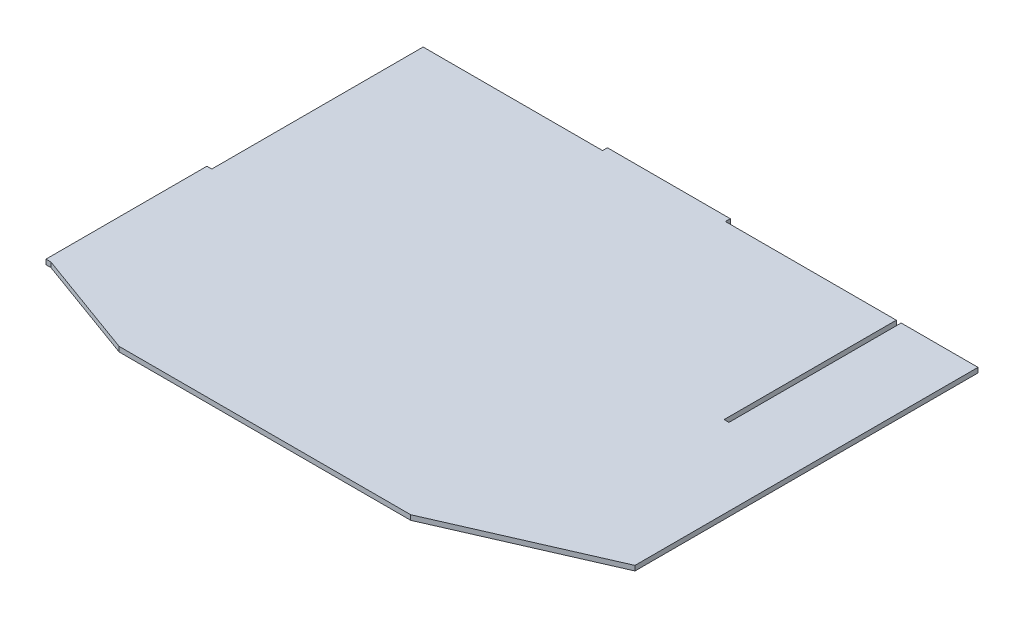
ISO-10303-21;
HEADER;
FILE_DESCRIPTION(('STEP AP214'),'2;1');
FILE_NAME('part.step','',(''),(''),'','','');
FILE_SCHEMA(('AUTOMOTIVE_DESIGN { 1 0 10303 214 1 1 1 1 }'));
ENDSEC;
DATA;
#1=APPLICATION_CONTEXT('core data for automotive mechanical design processes');
#2=APPLICATION_PROTOCOL_DEFINITION('international standard','automotive_design',2000,#1);
#3=PRODUCT_CONTEXT('',#1,'mechanical');
#4=PRODUCT('Part','Part','',(#3));
#5=PRODUCT_RELATED_PRODUCT_CATEGORY('part','',(#4));
#6=PRODUCT_DEFINITION_FORMATION('','',#4);
#7=PRODUCT_DEFINITION_CONTEXT('part definition',#1,'design');
#8=PRODUCT_DEFINITION('design','',#6,#7);
#9=PRODUCT_DEFINITION_SHAPE('','',#8);
#10=(LENGTH_UNIT() NAMED_UNIT(*) SI_UNIT(.MILLI.,.METRE.));
#11=(NAMED_UNIT(*) PLANE_ANGLE_UNIT() SI_UNIT($,.RADIAN.));
#12=(NAMED_UNIT(*) SI_UNIT($,.STERADIAN.) SOLID_ANGLE_UNIT());
#13=UNCERTAINTY_MEASURE_WITH_UNIT(LENGTH_MEASURE(1.E-05),#10,'distance_accuracy_value','');
#14=(GEOMETRIC_REPRESENTATION_CONTEXT(3) GLOBAL_UNCERTAINTY_ASSIGNED_CONTEXT((#13)) GLOBAL_UNIT_ASSIGNED_CONTEXT((#10,
#11,#12)) REPRESENTATION_CONTEXT('',''));
#15=CARTESIAN_POINT('',(0.,0.,0.));
#16=DIRECTION('',(0.,0.,1.));
#17=DIRECTION('',(1.,0.,0.));
#18=AXIS2_PLACEMENT_3D('',#15,#16,#17);
#19=CARTESIAN_POINT('',(-154.0556,-1.5875,267.83));
#20=DIRECTION('',(1.,0.,0.));
#21=DIRECTION('',(0.,0.,-1.));
#22=AXIS2_PLACEMENT_3D('',#19,#20,#21);
#23=PLANE('',#22);
#24=DIRECTION('',(0.,-1.,0.));
#25=VECTOR('',#24,1.);
#26=CARTESIAN_POINT('',(-154.0556,-1.59799669999838,137.650000036));
#27=LINE('',#26,#25);
#28=CARTESIAN_POINT('',(-154.0556,1.5875,137.650000036));
#29=VERTEX_POINT('',#28);
#30=CARTESIAN_POINT('',(-154.0556,-1.5875,137.650000036));
#31=VERTEX_POINT('',#30);
#32=EDGE_CURVE('E58',#29,#31,#27,.T.);
#33=ORIENTED_EDGE('',*,*,#32,.F.);
#34=DIRECTION('',(0.,0.,-1.));
#35=VECTOR('',#34,1.);
#36=CARTESIAN_POINT('',(-154.0556,1.5875,267.83));
#37=LINE('',#36,#35);
#38=CARTESIAN_POINT('',(-154.0556,1.5875,0.));
#39=VERTEX_POINT('',#38);
#40=EDGE_CURVE('E51',#29,#39,#37,.T.);
#41=ORIENTED_EDGE('',*,*,#40,.T.);
#42=DIRECTION('',(0.,-1.,0.));
#43=VECTOR('',#42,1.);
#44=CARTESIAN_POINT('',(-154.0556,-1.5875,0.));
#45=LINE('',#44,#43);
#46=CARTESIAN_POINT('',(-154.0556,-1.5875,0.));
#47=VERTEX_POINT('',#46);
#48=EDGE_CURVE('E289',#39,#47,#45,.T.);
#49=ORIENTED_EDGE('',*,*,#48,.T.);
#50=DIRECTION('',(0.,0.,-1.));
#51=VECTOR('',#50,1.);
#52=CARTESIAN_POINT('',(-154.0556,-1.5875,267.83));
#53=LINE('',#52,#51);
#54=EDGE_CURVE('E297',#31,#47,#53,.T.);
#55=ORIENTED_EDGE('',*,*,#54,.F.);
#56=EDGE_LOOP('',(#33,#41,#49,#55));
#57=FACE_BOUND('',#56,.T.);
#58=ADVANCED_FACE('F43',(#57),#23,.F.);
#59=CARTESIAN_POINT('',(0.,0.,0.));
#60=DIRECTION('',(0.,0.,-1.));
#61=DIRECTION('',(-1.,0.,0.));
#62=AXIS2_PLACEMENT_3D('',#59,#60,#61);
#63=PLANE('',#62);
#64=DIRECTION('',(-1.,0.,0.));
#65=VECTOR('',#64,1.);
#66=CARTESIAN_POINT('',(-154.0556,1.5875,0.));
#67=LINE('',#66,#65);
#68=CARTESIAN_POINT('',(-37.2160000199976,1.58750000000041,0.));
#69=VERTEX_POINT('',#68);
#70=EDGE_CURVE('E285',#69,#39,#67,.T.);
#71=ORIENTED_EDGE('',*,*,#70,.F.);
#72=DIRECTION('',(0.,1.,0.));
#73=VECTOR('',#72,1.);
#74=CARTESIAN_POINT('',(-37.2160000199976,1.58750000000041,0.));
#75=LINE('',#74,#73);
#76=CARTESIAN_POINT('',(-37.2160000199976,-1.5875000000004,0.));
#77=VERTEX_POINT('',#76);
#78=EDGE_CURVE('E205',#77,#69,#75,.T.);
#79=ORIENTED_EDGE('',*,*,#78,.F.);
#80=DIRECTION('',(1.,0.,0.));
#81=VECTOR('',#80,1.);
#82=CARTESIAN_POINT('',(-154.0556,-1.5875,0.));
#83=LINE('',#82,#81);
#84=EDGE_CURVE('E280',#47,#77,#83,.T.);
#85=ORIENTED_EDGE('',*,*,#84,.F.);
#86=ORIENTED_EDGE('',*,*,#48,.F.);
#87=EDGE_LOOP('',(#71,#79,#85,#86));
#88=FACE_BOUND('',#87,.T.);
#89=ADVANCED_FACE('F308',(#88),#63,.T.);
#90=CARTESIAN_POINT('',(42.7839999800023,-1.5875,0.));
#91=VERTEX_POINT('',#90);
#92=CARTESIAN_POINT('',(154.0556,-1.5875,0.));
#93=VERTEX_POINT('',#92);
#94=EDGE_CURVE('E292',#91,#93,#83,.T.);
#95=ORIENTED_EDGE('',*,*,#94,.F.);
#96=DIRECTION('',(0.,-1.,0.));
#97=VECTOR('',#96,1.);
#98=CARTESIAN_POINT('',(42.7839999800024,1.5875000000004,0.));
#99=LINE('',#98,#97);
#100=CARTESIAN_POINT('',(42.7839999800024,1.5875000000004,0.));
#101=VERTEX_POINT('',#100);
#102=EDGE_CURVE('E211',#101,#91,#99,.T.);
#103=ORIENTED_EDGE('',*,*,#102,.F.);
#104=CARTESIAN_POINT('',(154.0556,1.5875,0.));
#105=VERTEX_POINT('',#104);
#106=EDGE_CURVE('E286',#105,#101,#67,.T.);
#107=ORIENTED_EDGE('',*,*,#106,.F.);
#108=DIRECTION('',(0.,1.,0.));
#109=VECTOR('',#108,1.);
#110=CARTESIAN_POINT('',(154.0556,-1.5875,0.));
#111=LINE('',#110,#109);
#112=EDGE_CURVE('E275',#93,#105,#111,.T.);
#113=ORIENTED_EDGE('',*,*,#112,.F.);
#114=EDGE_LOOP('',(#95,#103,#107,#113));
#115=FACE_BOUND('',#114,.T.);
#116=ADVANCED_FACE('F362',(#115),#63,.T.);
#117=CARTESIAN_POINT('',(-154.0556,1.5875,267.83));
#118=DIRECTION('',(0.,-1.,0.));
#119=DIRECTION('',(0.,0.,-1.));
#120=AXIS2_PLACEMENT_3D('',#117,#118,#119);
#121=PLANE('',#120);
#122=ORIENTED_EDGE('',*,*,#40,.F.);
#123=DIRECTION('',(1.,0.,0.));
#124=VECTOR('',#123,1.);
#125=CARTESIAN_POINT('',(-157.2306,1.5875,137.650000036));
#126=LINE('',#125,#124);
#127=CARTESIAN_POINT('',(-157.2306,1.5875,137.650000036));
#128=VERTEX_POINT('',#127);
#129=EDGE_CURVE('E323',#128,#29,#126,.T.);
#130=ORIENTED_EDGE('',*,*,#129,.F.);
#131=DIRECTION('',(0.,0.,-1.));
#132=VECTOR('',#131,1.);
#133=CARTESIAN_POINT('',(-157.2306,1.5875,137.650000036));
#134=LINE('',#133,#132);
#135=CARTESIAN_POINT('',(-157.2306,1.5875,242.43));
#136=VERTEX_POINT('',#135);
#137=EDGE_CURVE('E183',#136,#128,#134,.T.);
#138=ORIENTED_EDGE('',*,*,#137,.F.);
#139=DIRECTION('',(1.,0.,0.));
#140=VECTOR('',#139,1.);
#141=CARTESIAN_POINT('',(-157.2306,1.5875,242.43));
#142=LINE('',#141,#140);
#143=CARTESIAN_POINT('',(-154.0556,1.5875,242.43));
#144=VERTEX_POINT('',#143);
#145=EDGE_CURVE('E196',#136,#144,#142,.T.);
#146=ORIENTED_EDGE('',*,*,#145,.T.);
#147=DIRECTION('',(0.939793423488437,0.,0.341743063086704));
#148=VECTOR('',#147,1.);
#149=CARTESIAN_POINT('',(-95.8526248175183,1.58750000000041,263.594718248175));
#150=LINE('',#149,#148);
#151=CARTESIAN_POINT('',(-84.2056,1.58750000000041,267.83));
#152=VERTEX_POINT('',#151);
#153=EDGE_CURVE('E66',#144,#152,#150,.T.);
#154=ORIENTED_EDGE('',*,*,#153,.T.);
#155=DIRECTION('',(-1.,0.,0.));
#156=VECTOR('',#155,1.);
#157=CARTESIAN_POINT('',(-154.0556,1.5875,267.83));
#158=LINE('',#157,#156);
#159=CARTESIAN_POINT('',(105.6686,1.5875,267.83));
#160=VERTEX_POINT('',#159);
#161=EDGE_CURVE('E276',#160,#152,#158,.T.);
#162=ORIENTED_EDGE('',*,*,#161,.F.);
#163=DIRECTION('',(0.916157334902189,0.,-0.400818834019708));
#164=VECTOR('',#163,1.);
#165=CARTESIAN_POINT('',(115.326955409836,1.5875,263.604469508197));
#166=LINE('',#165,#164);
#167=CARTESIAN_POINT('',(207.2686,1.5875,223.38));
#168=VERTEX_POINT('',#167);
#169=EDGE_CURVE('E229',#160,#168,#166,.T.);
#170=ORIENTED_EDGE('',*,*,#169,.T.);
#171=DIRECTION('',(0.,0.,1.));
#172=VECTOR('',#171,1.);
#173=CARTESIAN_POINT('',(207.2686,1.5875,0.));
#174=LINE('',#173,#172);
#175=CARTESIAN_POINT('',(207.2686,1.5875,0.));
#176=VERTEX_POINT('',#175);
#177=EDGE_CURVE('E256',#176,#168,#174,.T.);
#178=ORIENTED_EDGE('',*,*,#177,.F.);
#179=DIRECTION('',(-1.,0.,0.));
#180=VECTOR('',#179,1.);
#181=CARTESIAN_POINT('',(157.2306,1.5875,0.));
#182=LINE('',#181,#180);
#183=CARTESIAN_POINT('',(157.2306,1.5875,0.));
#184=VERTEX_POINT('',#183);
#185=EDGE_CURVE('E248',#176,#184,#182,.T.);
#186=ORIENTED_EDGE('',*,*,#185,.T.);
#187=DIRECTION('',(0.,0.,1.));
#188=VECTOR('',#187,1.);
#189=CARTESIAN_POINT('',(157.2306,1.5875,0.));
#190=LINE('',#189,#188);
#191=CARTESIAN_POINT('',(157.2306,1.5875,112.128));
#192=VERTEX_POINT('',#191);
#193=EDGE_CURVE('E252',#184,#192,#190,.T.);
#194=ORIENTED_EDGE('',*,*,#193,.T.);
#195=DIRECTION('',(-1.,0.,0.));
#196=VECTOR('',#195,1.);
#197=CARTESIAN_POINT('',(157.2306,1.5875,112.128));
#198=LINE('',#197,#196);
#199=CARTESIAN_POINT('',(154.0556,1.5875,112.128));
#200=VERTEX_POINT('',#199);
#201=EDGE_CURVE('E267',#192,#200,#198,.T.);
#202=ORIENTED_EDGE('',*,*,#201,.T.);
#203=DIRECTION('',(0.,0.,-1.));
#204=VECTOR('',#203,1.);
#205=CARTESIAN_POINT('',(154.0556,1.5875,267.83));
#206=LINE('',#205,#204);
#207=EDGE_CURVE('E11',#200,#105,#206,.T.);
#208=ORIENTED_EDGE('',*,*,#207,.T.);
#209=ORIENTED_EDGE('',*,*,#106,.T.);
#210=DIRECTION('',(0.,0.,1.));
#211=VECTOR('',#210,1.);
#212=CARTESIAN_POINT('',(42.7839999800024,1.5875000000004,-3.175));
#213=LINE('',#212,#211);
#214=CARTESIAN_POINT('',(42.7839999800024,1.5875000000004,-3.175));
#215=VERTEX_POINT('',#214);
#216=EDGE_CURVE('E225',#215,#101,#213,.T.);
#217=ORIENTED_EDGE('',*,*,#216,.F.);
#218=DIRECTION('',(1.,0.,0.));
#219=VECTOR('',#218,1.);
#220=CARTESIAN_POINT('',(-37.2160000199976,1.58750000000041,-3.175));
#221=LINE('',#220,#219);
#222=CARTESIAN_POINT('',(-37.2160000199976,1.58750000000041,-3.175));
#223=VERTEX_POINT('',#222);
#224=EDGE_CURVE('E210',#223,#215,#221,.T.);
#225=ORIENTED_EDGE('',*,*,#224,.F.);
#226=DIRECTION('',(0.,0.,1.));
#227=VECTOR('',#226,1.);
#228=CARTESIAN_POINT('',(-37.2160000199976,1.58750000000041,-3.175));
#229=LINE('',#228,#227);
#230=EDGE_CURVE('E227',#223,#69,#229,.T.);
#231=ORIENTED_EDGE('',*,*,#230,.T.);
#232=ORIENTED_EDGE('',*,*,#70,.T.);
#233=EDGE_LOOP('',(#122,#130,#138,#146,#154,#162,#170,#178,#186,#194,#202,#208,#209,#217,#225,
#231,#232));
#234=FACE_BOUND('',#233,.T.);
#235=ADVANCED_FACE('F304',(#234),#121,.F.);
#236=CARTESIAN_POINT('',(-154.0556,-1.5875,267.83));
#237=DIRECTION('',(0.,1.,0.));
#238=DIRECTION('',(0.,0.,1.));
#239=AXIS2_PLACEMENT_3D('',#236,#237,#238);
#240=PLANE('',#239);
#241=DIRECTION('',(1.,0.,0.));
#242=VECTOR('',#241,1.);
#243=CARTESIAN_POINT('',(-154.0556,-1.5875,267.83));
#244=LINE('',#243,#242);
#245=CARTESIAN_POINT('',(-84.2056,-1.5875,267.83));
#246=VERTEX_POINT('',#245);
#247=CARTESIAN_POINT('',(105.6686,-1.5875,267.83));
#248=VERTEX_POINT('',#247);
#249=EDGE_CURVE('E279',#246,#248,#244,.T.);
#250=ORIENTED_EDGE('',*,*,#249,.F.);
#251=DIRECTION('',(0.939793423488437,0.,0.341743063086704));
#252=VECTOR('',#251,1.);
#253=CARTESIAN_POINT('',(-95.8526248175183,-1.5875,263.594718248175));
#254=LINE('',#253,#252);
#255=CARTESIAN_POINT('',(-154.0556,-1.5875,242.43));
#256=VERTEX_POINT('',#255);
#257=EDGE_CURVE('E193',#256,#246,#254,.T.);
#258=ORIENTED_EDGE('',*,*,#257,.F.);
#259=EDGE_CURVE('E298',#256,#31,#53,.T.);
#260=ORIENTED_EDGE('',*,*,#259,.T.);
#261=ORIENTED_EDGE('',*,*,#54,.T.);
#262=ORIENTED_EDGE('',*,*,#84,.T.);
#263=DIRECTION('',(0.,0.,1.));
#264=VECTOR('',#263,1.);
#265=CARTESIAN_POINT('',(-37.2160000199976,-1.5875000000004,-3.175));
#266=LINE('',#265,#264);
#267=CARTESIAN_POINT('',(-37.2160000199976,-1.5875000000004,-3.175));
#268=VERTEX_POINT('',#267);
#269=EDGE_CURVE('E217',#268,#77,#266,.T.);
#270=ORIENTED_EDGE('',*,*,#269,.F.);
#271=DIRECTION('',(-1.,0.,0.));
#272=VECTOR('',#271,1.);
#273=CARTESIAN_POINT('',(-37.2160000199976,-1.5875000000004,-3.175));
#274=LINE('',#273,#272);
#275=CARTESIAN_POINT('',(42.7839999800024,-1.58750000000041,-3.175));
#276=VERTEX_POINT('',#275);
#277=EDGE_CURVE('E215',#276,#268,#274,.T.);
#278=ORIENTED_EDGE('',*,*,#277,.F.);
#279=DIRECTION('',(0.,0.,1.));
#280=VECTOR('',#279,1.);
#281=CARTESIAN_POINT('',(42.7839999800024,-1.58750000000041,-3.175));
#282=LINE('',#281,#280);
#283=EDGE_CURVE('E223',#276,#91,#282,.T.);
#284=ORIENTED_EDGE('',*,*,#283,.T.);
#285=ORIENTED_EDGE('',*,*,#94,.T.);
#286=DIRECTION('',(0.,0.,-1.));
#287=VECTOR('',#286,1.);
#288=CARTESIAN_POINT('',(154.0556,-1.5875,267.83));
#289=LINE('',#288,#287);
#290=CARTESIAN_POINT('',(154.0556,-1.5875,112.128));
#291=VERTEX_POINT('',#290);
#292=EDGE_CURVE('E282',#291,#93,#289,.T.);
#293=ORIENTED_EDGE('',*,*,#292,.F.);
#294=DIRECTION('',(-1.,0.,0.));
#295=VECTOR('',#294,1.);
#296=CARTESIAN_POINT('',(157.2306,-1.5875,112.128));
#297=LINE('',#296,#295);
#298=CARTESIAN_POINT('',(157.2306,-1.5875,112.128));
#299=VERTEX_POINT('',#298);
#300=EDGE_CURVE('E272',#299,#291,#297,.T.);
#301=ORIENTED_EDGE('',*,*,#300,.F.);
#302=DIRECTION('',(0.,0.,1.));
#303=VECTOR('',#302,1.);
#304=CARTESIAN_POINT('',(157.2306,-1.5875,0.));
#305=LINE('',#304,#303);
#306=CARTESIAN_POINT('',(157.2306,-1.5875,0.));
#307=VERTEX_POINT('',#306);
#308=EDGE_CURVE('E251',#307,#299,#305,.T.);
#309=ORIENTED_EDGE('',*,*,#308,.F.);
#310=DIRECTION('',(1.,0.,0.));
#311=VECTOR('',#310,1.);
#312=CARTESIAN_POINT('',(157.2306,-1.5875,0.));
#313=LINE('',#312,#311);
#314=CARTESIAN_POINT('',(207.2686,-1.5875,0.));
#315=VERTEX_POINT('',#314);
#316=EDGE_CURVE('E242',#307,#315,#313,.T.);
#317=ORIENTED_EDGE('',*,*,#316,.T.);
#318=DIRECTION('',(0.,0.,1.));
#319=VECTOR('',#318,1.);
#320=CARTESIAN_POINT('',(207.2686,-1.5875,0.));
#321=LINE('',#320,#319);
#322=CARTESIAN_POINT('',(207.2686,-1.5875,223.38));
#323=VERTEX_POINT('',#322);
#324=EDGE_CURVE('E259',#315,#323,#321,.T.);
#325=ORIENTED_EDGE('',*,*,#324,.T.);
#326=DIRECTION('',(0.916157334902189,0.,-0.400818834019708));
#327=VECTOR('',#326,1.);
#328=CARTESIAN_POINT('',(115.326955409836,-1.5875,263.604469508197));
#329=LINE('',#328,#327);
#330=EDGE_CURVE('E230',#248,#323,#329,.T.);
#331=ORIENTED_EDGE('',*,*,#330,.F.);
#332=EDGE_LOOP('',(#250,#258,#260,#261,#262,#270,#278,#284,#285,#293,#301,#309,#317,#325,#331));
#333=FACE_BOUND('',#332,.T.);
#334=ADVANCED_FACE('F312',(#333),#240,.F.);
#335=CARTESIAN_POINT('',(0.,0.,267.83));
#336=DIRECTION('',(0.,0.,-1.));
#337=DIRECTION('',(-1.,0.,0.));
#338=AXIS2_PLACEMENT_3D('',#335,#336,#337);
#339=PLANE('',#338);
#340=ORIENTED_EDGE('',*,*,#161,.T.);
#341=DIRECTION('',(0.,-1.,0.));
#342=VECTOR('',#341,1.);
#343=CARTESIAN_POINT('',(-84.2056,1.58750000000041,267.83));
#344=LINE('',#343,#342);
#345=EDGE_CURVE('E202',#152,#246,#344,.T.);
#346=ORIENTED_EDGE('',*,*,#345,.T.);
#347=ORIENTED_EDGE('',*,*,#249,.T.);
#348=DIRECTION('',(0.,1.,0.));
#349=VECTOR('',#348,1.);
#350=CARTESIAN_POINT('',(105.6686,-1.5875,267.83));
#351=LINE('',#350,#349);
#352=EDGE_CURVE('E232',#248,#160,#351,.T.);
#353=ORIENTED_EDGE('',*,*,#352,.T.);
#354=EDGE_LOOP('',(#340,#346,#347,#353));
#355=FACE_BOUND('',#354,.T.);
#356=ADVANCED_FACE('F338',(#355),#339,.F.);
#357=CARTESIAN_POINT('',(207.2686,-1.5875,0.));
#358=DIRECTION('',(1.,0.,0.));
#359=DIRECTION('',(0.,0.,-1.));
#360=AXIS2_PLACEMENT_3D('',#357,#358,#359);
#361=PLANE('',#360);
#362=ORIENTED_EDGE('',*,*,#177,.T.);
#363=DIRECTION('',(0.,1.,0.));
#364=VECTOR('',#363,1.);
#365=CARTESIAN_POINT('',(207.2686,-1.5875,223.38));
#366=LINE('',#365,#364);
#367=EDGE_CURVE('E235',#323,#168,#366,.T.);
#368=ORIENTED_EDGE('',*,*,#367,.F.);
#369=ORIENTED_EDGE('',*,*,#324,.F.);
#370=DIRECTION('',(0.,1.,0.));
#371=VECTOR('',#370,1.);
#372=CARTESIAN_POINT('',(207.2686,-1.5875,0.));
#373=LINE('',#372,#371);
#374=EDGE_CURVE('E245',#315,#176,#373,.T.);
#375=ORIENTED_EDGE('',*,*,#374,.T.);
#376=EDGE_LOOP('',(#362,#368,#369,#375));
#377=FACE_BOUND('',#376,.T.);
#378=ADVANCED_FACE('F343',(#377),#361,.T.);
#379=CARTESIAN_POINT('',(154.0556,-1.5875,267.83));
#380=DIRECTION('',(-1.,0.,0.));
#381=DIRECTION('',(0.,0.,1.));
#382=AXIS2_PLACEMENT_3D('',#379,#380,#381);
#383=PLANE('',#382);
#384=DIRECTION('',(0.,1.,0.));
#385=VECTOR('',#384,1.);
#386=CARTESIAN_POINT('',(154.0556,-1.5875,112.128));
#387=LINE('',#386,#385);
#388=EDGE_CURVE('E255',#291,#200,#387,.T.);
#389=ORIENTED_EDGE('',*,*,#388,.F.);
#390=ORIENTED_EDGE('',*,*,#292,.T.);
#391=ORIENTED_EDGE('',*,*,#112,.T.);
#392=ORIENTED_EDGE('',*,*,#207,.F.);
#393=EDGE_LOOP('',(#389,#390,#391,#392));
#394=FACE_BOUND('',#393,.T.);
#395=ADVANCED_FACE('F45',(#394),#383,.F.);
#396=CARTESIAN_POINT('',(157.2306,-1.5875,112.128));
#397=DIRECTION('',(0.,0.,1.));
#398=DIRECTION('',(1.,0.,0.));
#399=AXIS2_PLACEMENT_3D('',#396,#397,#398);
#400=PLANE('',#399);
#401=ORIENTED_EDGE('',*,*,#388,.T.);
#402=ORIENTED_EDGE('',*,*,#201,.F.);
#403=DIRECTION('',(0.,1.,0.));
#404=VECTOR('',#403,1.);
#405=CARTESIAN_POINT('',(157.2306,-1.5875,112.128));
#406=LINE('',#405,#404);
#407=EDGE_CURVE('E264',#299,#192,#406,.T.);
#408=ORIENTED_EDGE('',*,*,#407,.F.);
#409=ORIENTED_EDGE('',*,*,#300,.T.);
#410=EDGE_LOOP('',(#401,#402,#408,#409));
#411=FACE_BOUND('',#410,.T.);
#412=ADVANCED_FACE('F354',(#411),#400,.F.);
#413=CARTESIAN_POINT('',(157.2306,-1.5875,0.));
#414=DIRECTION('',(-1.,0.,0.));
#415=DIRECTION('',(0.,0.,1.));
#416=AXIS2_PLACEMENT_3D('',#413,#414,#415);
#417=PLANE('',#416);
#418=ORIENTED_EDGE('',*,*,#308,.T.);
#419=ORIENTED_EDGE('',*,*,#407,.T.);
#420=ORIENTED_EDGE('',*,*,#193,.F.);
#421=DIRECTION('',(0.,-1.,0.));
#422=VECTOR('',#421,1.);
#423=CARTESIAN_POINT('',(157.2306,-1.5875,0.));
#424=LINE('',#423,#422);
#425=EDGE_CURVE('E237',#184,#307,#424,.T.);
#426=ORIENTED_EDGE('',*,*,#425,.T.);
#427=EDGE_LOOP('',(#418,#419,#420,#426));
#428=FACE_BOUND('',#427,.T.);
#429=ADVANCED_FACE('F351',(#428),#417,.T.);
#430=CARTESIAN_POINT('',(0.,0.,0.));
#431=DIRECTION('',(0.,0.,-1.));
#432=DIRECTION('',(-1.,0.,0.));
#433=AXIS2_PLACEMENT_3D('',#430,#431,#432);
#434=PLANE('',#433);
#435=ORIENTED_EDGE('',*,*,#425,.F.);
#436=ORIENTED_EDGE('',*,*,#185,.F.);
#437=ORIENTED_EDGE('',*,*,#374,.F.);
#438=ORIENTED_EDGE('',*,*,#316,.F.);
#439=EDGE_LOOP('',(#435,#436,#437,#438));
#440=FACE_BOUND('',#439,.T.);
#441=ADVANCED_FACE('F349',(#440),#434,.T.);
#442=CARTESIAN_POINT('',(115.326955409836,-1.5875,263.604469508197));
#443=DIRECTION('',(0.400818834019708,0.,0.916157334902189));
#444=DIRECTION('',(0.916157334902189,0.,-0.400818834019708));
#445=AXIS2_PLACEMENT_3D('',#442,#443,#444);
#446=PLANE('',#445);
#447=ORIENTED_EDGE('',*,*,#169,.F.);
#448=ORIENTED_EDGE('',*,*,#352,.F.);
#449=ORIENTED_EDGE('',*,*,#330,.T.);
#450=ORIENTED_EDGE('',*,*,#367,.T.);
#451=EDGE_LOOP('',(#447,#448,#449,#450));
#452=FACE_BOUND('',#451,.T.);
#453=ADVANCED_FACE('F340',(#452),#446,.T.);
#454=CARTESIAN_POINT('',(-37.2160000199976,1.58750000000041,-3.175));
#455=DIRECTION('',(1.,0.,0.));
#456=DIRECTION('',(0.,0.,-1.));
#457=AXIS2_PLACEMENT_3D('',#454,#455,#456);
#458=PLANE('',#457);
#459=ORIENTED_EDGE('',*,*,#78,.T.);
#460=ORIENTED_EDGE('',*,*,#230,.F.);
#461=DIRECTION('',(0.,1.,0.));
#462=VECTOR('',#461,1.);
#463=CARTESIAN_POINT('',(-37.2160000199976,1.58750000000041,-3.175));
#464=LINE('',#463,#462);
#465=EDGE_CURVE('E207',#268,#223,#464,.T.);
#466=ORIENTED_EDGE('',*,*,#465,.F.);
#467=ORIENTED_EDGE('',*,*,#269,.T.);
#468=EDGE_LOOP('',(#459,#460,#466,#467));
#469=FACE_BOUND('',#468,.T.);
#470=ADVANCED_FACE('F371',(#469),#458,.F.);
#471=CARTESIAN_POINT('',(42.7839999800024,1.5875000000004,-3.175));
#472=DIRECTION('',(-1.,0.,0.));
#473=DIRECTION('',(0.,-1.,0.));
#474=AXIS2_PLACEMENT_3D('',#471,#472,#473);
#475=PLANE('',#474);
#476=ORIENTED_EDGE('',*,*,#102,.T.);
#477=ORIENTED_EDGE('',*,*,#283,.F.);
#478=DIRECTION('',(0.,-1.,0.));
#479=VECTOR('',#478,1.);
#480=CARTESIAN_POINT('',(42.7839999800024,1.5875000000004,-3.175));
#481=LINE('',#480,#479);
#482=EDGE_CURVE('E213',#215,#276,#481,.T.);
#483=ORIENTED_EDGE('',*,*,#482,.F.);
#484=ORIENTED_EDGE('',*,*,#216,.T.);
#485=EDGE_LOOP('',(#476,#477,#483,#484));
#486=FACE_BOUND('',#485,.T.);
#487=ADVANCED_FACE('F367',(#486),#475,.F.);
#488=CARTESIAN_POINT('',(0.,0.,-3.175));
#489=DIRECTION('',(0.,0.,1.));
#490=DIRECTION('',(1.,0.,0.));
#491=AXIS2_PLACEMENT_3D('',#488,#489,#490);
#492=PLANE('',#491);
#493=ORIENTED_EDGE('',*,*,#465,.T.);
#494=ORIENTED_EDGE('',*,*,#224,.T.);
#495=ORIENTED_EDGE('',*,*,#482,.T.);
#496=ORIENTED_EDGE('',*,*,#277,.T.);
#497=EDGE_LOOP('',(#493,#494,#495,#496));
#498=FACE_BOUND('',#497,.T.);
#499=ADVANCED_FACE('F369',(#498),#492,.F.);
#500=CARTESIAN_POINT('',(-95.8526248175183,1.58750000000041,263.594718248175));
#501=DIRECTION('',(0.341743063086704,0.,-0.939793423488437));
#502=DIRECTION('',(-0.939793423488437,0.,-0.341743063086704));
#503=AXIS2_PLACEMENT_3D('',#500,#501,#502);
#504=PLANE('',#503);
#505=ORIENTED_EDGE('',*,*,#257,.T.);
#506=ORIENTED_EDGE('',*,*,#345,.F.);
#507=ORIENTED_EDGE('',*,*,#153,.F.);
#508=DIRECTION('',(0.,-1.,0.));
#509=VECTOR('',#508,1.);
#510=CARTESIAN_POINT('',(-154.0556,1.58750000000041,242.43));
#511=LINE('',#510,#509);
#512=EDGE_CURVE('E200',#144,#256,#511,.T.);
#513=ORIENTED_EDGE('',*,*,#512,.T.);
#514=EDGE_LOOP('',(#505,#506,#507,#513));
#515=FACE_BOUND('',#514,.T.);
#516=ADVANCED_FACE('F334',(#515),#504,.F.);
#517=CARTESIAN_POINT('',(-154.0556,0.,0.));
#518=DIRECTION('',(1.,0.,0.));
#519=DIRECTION('',(0.,0.,-1.));
#520=AXIS2_PLACEMENT_3D('',#517,#518,#519);
#521=PLANE('',#520);
#522=ORIENTED_EDGE('',*,*,#259,.F.);
#523=DIRECTION('',(0.,1.,0.));
#524=VECTOR('',#523,1.);
#525=CARTESIAN_POINT('',(-154.0556,-1.59799669999838,242.43));
#526=LINE('',#525,#524);
#527=CARTESIAN_POINT('',(-154.0556,-1.59799669999838,242.43));
#528=VERTEX_POINT('',#527);
#529=EDGE_CURVE('E187',#528,#256,#526,.T.);
#530=ORIENTED_EDGE('',*,*,#529,.F.);
#531=DIRECTION('',(0.,0.,1.));
#532=VECTOR('',#531,1.);
#533=CARTESIAN_POINT('',(-154.0556,-1.59799669999838,137.650000036));
#534=LINE('',#533,#532);
#535=CARTESIAN_POINT('',(-154.0556,-1.59799669999838,137.650000036));
#536=VERTEX_POINT('',#535);
#537=EDGE_CURVE('E321',#536,#528,#534,.T.);
#538=ORIENTED_EDGE('',*,*,#537,.F.);
#539=EDGE_CURVE('E191',#31,#536,#27,.T.);
#540=ORIENTED_EDGE('',*,*,#539,.F.);
#541=EDGE_LOOP('',(#522,#530,#538,#540));
#542=FACE_BOUND('',#541,.T.);
#543=ADVANCED_FACE('F318',(#542),#521,.T.);
#544=CARTESIAN_POINT('',(-157.2306,-1.59799669999838,137.650000036));
#545=DIRECTION('',(0.,0.,1.));
#546=DIRECTION('',(1.,0.,0.));
#547=AXIS2_PLACEMENT_3D('',#544,#545,#546);
#548=PLANE('',#547);
#549=ORIENTED_EDGE('',*,*,#32,.T.);
#550=ORIENTED_EDGE('',*,*,#539,.T.);
#551=DIRECTION('',(1.,0.,0.));
#552=VECTOR('',#551,1.);
#553=CARTESIAN_POINT('',(-157.2306,-1.59799669999838,137.650000036));
#554=LINE('',#553,#552);
#555=CARTESIAN_POINT('',(-157.2306,-1.59799669999838,137.650000036));
#556=VERTEX_POINT('',#555);
#557=EDGE_CURVE('E172',#556,#536,#554,.T.);
#558=ORIENTED_EDGE('',*,*,#557,.F.);
#559=DIRECTION('',(0.,-1.,0.));
#560=VECTOR('',#559,1.);
#561=CARTESIAN_POINT('',(-157.2306,-1.59799669999838,137.650000036));
#562=LINE('',#561,#560);
#563=EDGE_CURVE('E178',#128,#556,#562,.T.);
#564=ORIENTED_EDGE('',*,*,#563,.F.);
#565=ORIENTED_EDGE('',*,*,#129,.T.);
#566=EDGE_LOOP('',(#549,#550,#558,#564,#565));
#567=FACE_BOUND('',#566,.T.);
#568=ADVANCED_FACE('F189',(#567),#548,.F.);
#569=CARTESIAN_POINT('',(-157.2306,-1.59799669999838,137.650000036));
#570=DIRECTION('',(0.,1.,0.));
#571=DIRECTION('',(0.,0.,1.));
#572=AXIS2_PLACEMENT_3D('',#569,#570,#571);
#573=PLANE('',#572);
#574=ORIENTED_EDGE('',*,*,#537,.T.);
#575=DIRECTION('',(1.,0.,0.));
#576=VECTOR('',#575,1.);
#577=CARTESIAN_POINT('',(-157.2306,-1.59799669999838,242.43));
#578=LINE('',#577,#576);
#579=CARTESIAN_POINT('',(-157.2306,-1.59799669999838,242.43));
#580=VERTEX_POINT('',#579);
#581=EDGE_CURVE('E174',#580,#528,#578,.T.);
#582=ORIENTED_EDGE('',*,*,#581,.F.);
#583=DIRECTION('',(0.,0.,1.));
#584=VECTOR('',#583,1.);
#585=CARTESIAN_POINT('',(-157.2306,-1.59799669999838,137.650000036));
#586=LINE('',#585,#584);
#587=EDGE_CURVE('E168',#556,#580,#586,.T.);
#588=ORIENTED_EDGE('',*,*,#587,.F.);
#589=ORIENTED_EDGE('',*,*,#557,.T.);
#590=EDGE_LOOP('',(#574,#582,#588,#589));
#591=FACE_BOUND('',#590,.T.);
#592=ADVANCED_FACE('F170',(#591),#573,.F.);
#593=CARTESIAN_POINT('',(-157.2306,-1.59799669999838,242.43));
#594=DIRECTION('',(0.,0.,-1.));
#595=DIRECTION('',(-1.,0.,0.));
#596=AXIS2_PLACEMENT_3D('',#593,#594,#595);
#597=PLANE('',#596);
#598=ORIENTED_EDGE('',*,*,#529,.T.);
#599=ORIENTED_EDGE('',*,*,#512,.F.);
#600=ORIENTED_EDGE('',*,*,#145,.F.);
#601=DIRECTION('',(0.,1.,0.));
#602=VECTOR('',#601,1.);
#603=CARTESIAN_POINT('',(-157.2306,-1.59799669999838,242.43));
#604=LINE('',#603,#602);
#605=EDGE_CURVE('E177',#580,#136,#604,.T.);
#606=ORIENTED_EDGE('',*,*,#605,.F.);
#607=ORIENTED_EDGE('',*,*,#581,.T.);
#608=EDGE_LOOP('',(#598,#599,#600,#606,#607));
#609=FACE_BOUND('',#608,.T.);
#610=ADVANCED_FACE('F333',(#609),#597,.F.);
#611=CARTESIAN_POINT('',(-157.2306,0.,0.));
#612=DIRECTION('',(1.,0.,0.));
#613=DIRECTION('',(0.,0.,-1.));
#614=AXIS2_PLACEMENT_3D('',#611,#612,#613);
#615=PLANE('',#614);
#616=ORIENTED_EDGE('',*,*,#563,.T.);
#617=ORIENTED_EDGE('',*,*,#587,.T.);
#618=ORIENTED_EDGE('',*,*,#605,.T.);
#619=ORIENTED_EDGE('',*,*,#137,.T.);
#620=EDGE_LOOP('',(#616,#617,#618,#619));
#621=FACE_BOUND('',#620,.T.);
#622=ADVANCED_FACE('F181',(#621),#615,.F.);
#623=CLOSED_SHELL('',(#58,#89,#116,#235,#334,#356,#378,#395,#412,#429,#441,#453,#470,#487,#499,
#516,#543,#568,#592,#610,#622));
#624=MANIFOLD_SOLID_BREP('B2',#623);
#625=ADVANCED_BREP_SHAPE_REPRESENTATION('',(#18,#624),#14);
#626=SHAPE_DEFINITION_REPRESENTATION(#9,#625);
ENDSEC;
END-ISO-10303-21;
